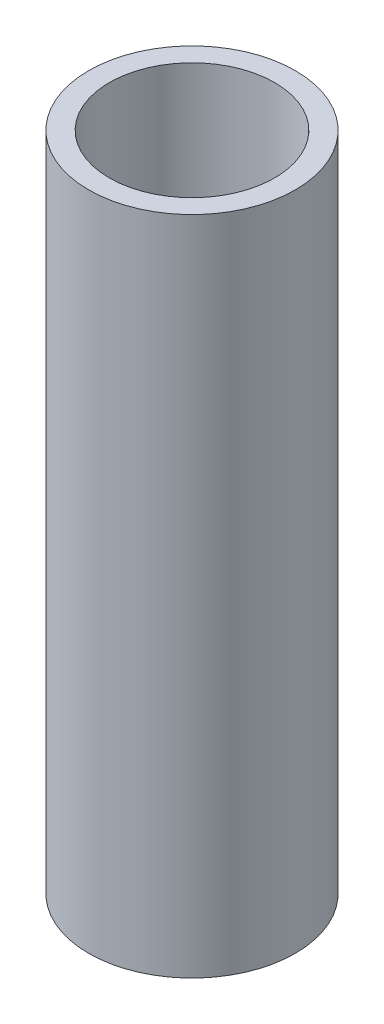
ISO-10303-21;
HEADER;
FILE_DESCRIPTION(('STEP AP214'),'2;1');
FILE_NAME('part.step','',(''),(''),'','','');
FILE_SCHEMA(('AUTOMOTIVE_DESIGN { 1 0 10303 214 1 1 1 1 }'));
ENDSEC;
DATA;
#1=APPLICATION_CONTEXT('core data for automotive mechanical design processes');
#2=APPLICATION_PROTOCOL_DEFINITION('international standard','automotive_design',2000,#1);
#3=PRODUCT_CONTEXT('',#1,'mechanical');
#4=PRODUCT('Part','Part','',(#3));
#5=PRODUCT_RELATED_PRODUCT_CATEGORY('part','',(#4));
#6=PRODUCT_DEFINITION_FORMATION('','',#4);
#7=PRODUCT_DEFINITION_CONTEXT('part definition',#1,'design');
#8=PRODUCT_DEFINITION('design','',#6,#7);
#9=PRODUCT_DEFINITION_SHAPE('','',#8);
#10=(LENGTH_UNIT() NAMED_UNIT(*) SI_UNIT(.MILLI.,.METRE.));
#11=(NAMED_UNIT(*) PLANE_ANGLE_UNIT() SI_UNIT($,.RADIAN.));
#12=(NAMED_UNIT(*) SI_UNIT($,.STERADIAN.) SOLID_ANGLE_UNIT());
#13=UNCERTAINTY_MEASURE_WITH_UNIT(LENGTH_MEASURE(1.E-05),#10,'distance_accuracy_value','');
#14=(GEOMETRIC_REPRESENTATION_CONTEXT(3) GLOBAL_UNCERTAINTY_ASSIGNED_CONTEXT((#13)) GLOBAL_UNIT_ASSIGNED_CONTEXT((#10,
#11,#12)) REPRESENTATION_CONTEXT('',''));
#15=CARTESIAN_POINT('',(0.,0.,0.));
#16=DIRECTION('',(0.,0.,1.));
#17=DIRECTION('',(1.,0.,0.));
#18=AXIS2_PLACEMENT_3D('',#15,#16,#17);
#19=CARTESIAN_POINT('',(0.,8.,0.));
#20=DIRECTION('',(0.,1.,0.));
#21=DIRECTION('',(0.,0.,1.));
#22=AXIS2_PLACEMENT_3D('',#19,#20,#21);
#23=PLANE('',#22);
#24=CARTESIAN_POINT('',(0.,8.,0.));
#25=DIRECTION('',(0.,1.,0.));
#26=DIRECTION('',(0.,0.,1.));
#27=AXIS2_PLACEMENT_3D('',#24,#25,#26);
#28=CIRCLE('',#27,1.25);
#29=CARTESIAN_POINT('',(0.,8.,1.25));
#30=VERTEX_POINT('',#29);
#31=EDGE_CURVE('E10',#30,#30,#28,.T.);
#32=ORIENTED_EDGE('',*,*,#31,.T.);
#33=EDGE_LOOP('',(#32));
#34=FACE_BOUND('',#33,.T.);
#35=CARTESIAN_POINT('',(0.,8.,0.));
#36=DIRECTION('',(0.,1.,0.));
#37=DIRECTION('',(0.,0.,1.));
#38=AXIS2_PLACEMENT_3D('',#35,#36,#37);
#39=CIRCLE('',#38,1.);
#40=CARTESIAN_POINT('',(0.,8.,1.));
#41=VERTEX_POINT('',#40);
#42=EDGE_CURVE('E41',#41,#41,#39,.T.);
#43=ORIENTED_EDGE('',*,*,#42,.F.);
#44=EDGE_LOOP('',(#43));
#45=FACE_BOUND('',#44,.T.);
#46=ADVANCED_FACE('F30',(#34,#45),#23,.T.);
#47=CARTESIAN_POINT('',(0.,0.,0.));
#48=DIRECTION('',(0.,1.,0.));
#49=DIRECTION('',(0.,0.,1.));
#50=AXIS2_PLACEMENT_3D('',#47,#48,#49);
#51=PLANE('',#50);
#52=CARTESIAN_POINT('',(0.,0.,0.));
#53=DIRECTION('',(0.,1.,0.));
#54=DIRECTION('',(0.,0.,1.));
#55=AXIS2_PLACEMENT_3D('',#52,#53,#54);
#56=CIRCLE('',#55,1.25);
#57=CARTESIAN_POINT('',(0.,0.,1.25));
#58=VERTEX_POINT('',#57);
#59=EDGE_CURVE('E34',#58,#58,#56,.T.);
#60=ORIENTED_EDGE('',*,*,#59,.F.);
#61=EDGE_LOOP('',(#60));
#62=FACE_BOUND('',#61,.T.);
#63=CARTESIAN_POINT('',(0.,0.,0.));
#64=DIRECTION('',(0.,1.,0.));
#65=DIRECTION('',(0.,0.,1.));
#66=AXIS2_PLACEMENT_3D('',#63,#64,#65);
#67=CIRCLE('',#66,1.);
#68=CARTESIAN_POINT('',(0.,0.,1.));
#69=VERTEX_POINT('',#68);
#70=EDGE_CURVE('E43',#69,#69,#67,.T.);
#71=ORIENTED_EDGE('',*,*,#70,.T.);
#72=EDGE_LOOP('',(#71));
#73=FACE_BOUND('',#72,.T.);
#74=ADVANCED_FACE('F53',(#62,#73),#51,.F.);
#75=CARTESIAN_POINT('',(0.,8.,0.));
#76=DIRECTION('',(0.,-1.,0.));
#77=DIRECTION('',(0.,0.,-1.));
#78=AXIS2_PLACEMENT_3D('',#75,#76,#77);
#79=CYLINDRICAL_SURFACE('',#78,1.25);
#80=ORIENTED_EDGE('',*,*,#31,.F.);
#81=EDGE_LOOP('',(#80));
#82=FACE_BOUND('',#81,.T.);
#83=ORIENTED_EDGE('',*,*,#59,.T.);
#84=EDGE_LOOP('',(#83));
#85=FACE_BOUND('',#84,.T.);
#86=ADVANCED_FACE('F32',(#82,#85),#79,.T.);
#87=CARTESIAN_POINT('',(0.,8.,0.));
#88=DIRECTION('',(0.,-1.,0.));
#89=DIRECTION('',(0.,0.,-1.));
#90=AXIS2_PLACEMENT_3D('',#87,#88,#89);
#91=CYLINDRICAL_SURFACE('',#90,1.);
#92=ORIENTED_EDGE('',*,*,#42,.T.);
#93=EDGE_LOOP('',(#92));
#94=FACE_BOUND('',#93,.T.);
#95=ORIENTED_EDGE('',*,*,#70,.F.);
#96=EDGE_LOOP('',(#95));
#97=FACE_BOUND('',#96,.T.);
#98=ADVANCED_FACE('F49',(#94,#97),#91,.F.);
#99=CLOSED_SHELL('',(#46,#74,#86,#98));
#100=MANIFOLD_SOLID_BREP('B2',#99);
#101=ADVANCED_BREP_SHAPE_REPRESENTATION('',(#18,#100),#14);
#102=SHAPE_DEFINITION_REPRESENTATION(#9,#101);
ENDSEC;
END-ISO-10303-21;
